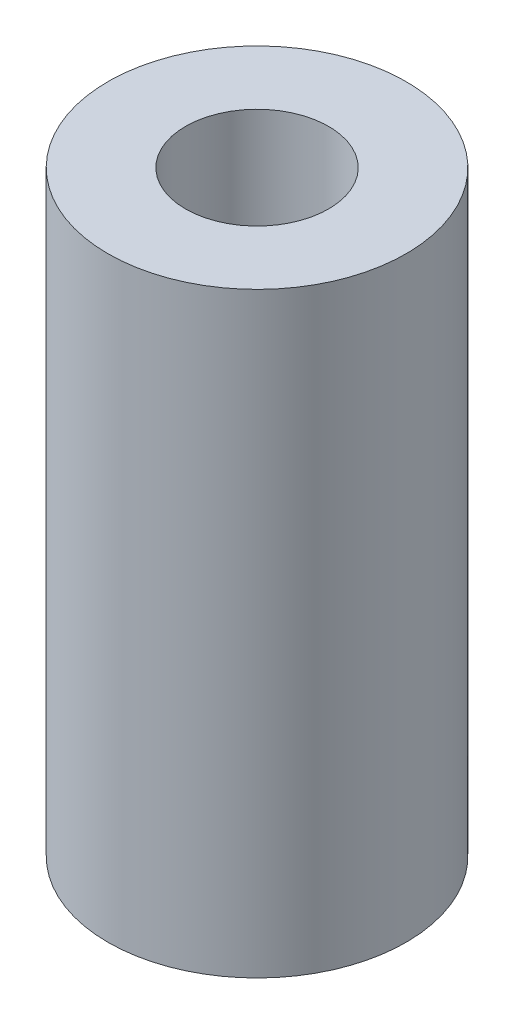
ISO-10303-21;
HEADER;
FILE_DESCRIPTION(('STEP AP214'),'2;1');
FILE_NAME('part.step','',(''),(''),'','','');
FILE_SCHEMA(('AUTOMOTIVE_DESIGN { 1 0 10303 214 1 1 1 1 }'));
ENDSEC;
DATA;
#1=APPLICATION_CONTEXT('core data for automotive mechanical design processes');
#2=APPLICATION_PROTOCOL_DEFINITION('international standard','automotive_design',2000,#1);
#3=PRODUCT_CONTEXT('',#1,'mechanical');
#4=PRODUCT('Part','Part','',(#3));
#5=PRODUCT_RELATED_PRODUCT_CATEGORY('part','',(#4));
#6=PRODUCT_DEFINITION_FORMATION('','',#4);
#7=PRODUCT_DEFINITION_CONTEXT('part definition',#1,'design');
#8=PRODUCT_DEFINITION('design','',#6,#7);
#9=PRODUCT_DEFINITION_SHAPE('','',#8);
#10=(LENGTH_UNIT() NAMED_UNIT(*) SI_UNIT(.MILLI.,.METRE.));
#11=(NAMED_UNIT(*) PLANE_ANGLE_UNIT() SI_UNIT($,.RADIAN.));
#12=(NAMED_UNIT(*) SI_UNIT($,.STERADIAN.) SOLID_ANGLE_UNIT());
#13=UNCERTAINTY_MEASURE_WITH_UNIT(LENGTH_MEASURE(1.E-05),#10,'distance_accuracy_value','');
#14=(GEOMETRIC_REPRESENTATION_CONTEXT(3) GLOBAL_UNCERTAINTY_ASSIGNED_CONTEXT((#13)) GLOBAL_UNIT_ASSIGNED_CONTEXT((#10,
#11,#12)) REPRESENTATION_CONTEXT('',''));
#15=CARTESIAN_POINT('',(0.,0.,0.));
#16=DIRECTION('',(0.,0.,1.));
#17=DIRECTION('',(1.,0.,0.));
#18=AXIS2_PLACEMENT_3D('',#15,#16,#17);
#19=CARTESIAN_POINT('',(0.,10.,0.));
#20=DIRECTION('',(0.,-1.,0.));
#21=DIRECTION('',(0.,0.,-1.));
#22=AXIS2_PLACEMENT_3D('',#19,#20,#21);
#23=CYLINDRICAL_SURFACE('',#22,2.5);
#24=CARTESIAN_POINT('',(0.,10.,0.));
#25=DIRECTION('',(0.,1.,0.));
#26=DIRECTION('',(0.,0.,1.));
#27=AXIS2_PLACEMENT_3D('',#24,#25,#26);
#28=CIRCLE('',#27,2.5);
#29=CARTESIAN_POINT('',(0.,10.,2.5));
#30=VERTEX_POINT('',#29);
#31=EDGE_CURVE('E10',#30,#30,#28,.T.);
#32=ORIENTED_EDGE('',*,*,#31,.F.);
#33=EDGE_LOOP('',(#32));
#34=FACE_BOUND('',#33,.T.);
#35=CARTESIAN_POINT('',(0.,0.,0.));
#36=DIRECTION('',(0.,1.,0.));
#37=DIRECTION('',(0.,0.,1.));
#38=AXIS2_PLACEMENT_3D('',#35,#36,#37);
#39=CIRCLE('',#38,2.5);
#40=CARTESIAN_POINT('',(0.,0.,2.5));
#41=VERTEX_POINT('',#40);
#42=EDGE_CURVE('E35',#41,#41,#39,.T.);
#43=ORIENTED_EDGE('',*,*,#42,.T.);
#44=EDGE_LOOP('',(#43));
#45=FACE_BOUND('',#44,.T.);
#46=ADVANCED_FACE('F32',(#34,#45),#23,.T.);
#47=CARTESIAN_POINT('',(0.,10.,0.));
#48=DIRECTION('',(0.,1.,0.));
#49=DIRECTION('',(0.,0.,1.));
#50=AXIS2_PLACEMENT_3D('',#47,#48,#49);
#51=PLANE('',#50);
#52=CARTESIAN_POINT('',(0.,10.,0.));
#53=DIRECTION('',(0.,1.,0.));
#54=DIRECTION('',(0.,0.,1.));
#55=AXIS2_PLACEMENT_3D('',#52,#53,#54);
#56=CIRCLE('',#55,1.2);
#57=CARTESIAN_POINT('',(0.,10.,1.2));
#58=VERTEX_POINT('',#57);
#59=EDGE_CURVE('E44',#58,#58,#56,.T.);
#60=ORIENTED_EDGE('',*,*,#59,.F.);
#61=EDGE_LOOP('',(#60));
#62=FACE_BOUND('',#61,.T.);
#63=ORIENTED_EDGE('',*,*,#31,.T.);
#64=EDGE_LOOP('',(#63));
#65=FACE_BOUND('',#64,.T.);
#66=ADVANCED_FACE('F69',(#62,#65),#51,.T.);
#67=CARTESIAN_POINT('',(0.,0.,0.));
#68=DIRECTION('',(0.,1.,0.));
#69=DIRECTION('',(0.,0.,1.));
#70=AXIS2_PLACEMENT_3D('',#67,#68,#69);
#71=PLANE('',#70);
#72=CARTESIAN_POINT('',(0.,0.,0.));
#73=DIRECTION('',(0.,-1.,0.));
#74=DIRECTION('',(0.,0.,-1.));
#75=AXIS2_PLACEMENT_3D('',#72,#73,#74);
#76=CIRCLE('',#75,1.2);
#77=CARTESIAN_POINT('',(0.,0.,-1.2));
#78=VERTEX_POINT('',#77);
#79=EDGE_CURVE('E50',#78,#78,#76,.T.);
#80=ORIENTED_EDGE('',*,*,#79,.F.);
#81=EDGE_LOOP('',(#80));
#82=FACE_BOUND('',#81,.T.);
#83=ORIENTED_EDGE('',*,*,#42,.F.);
#84=EDGE_LOOP('',(#83));
#85=FACE_BOUND('',#84,.T.);
#86=ADVANCED_FACE('F65',(#82,#85),#71,.F.);
#87=CARTESIAN_POINT('',(0.,7.,0.));
#88=DIRECTION('',(0.,1.,0.));
#89=DIRECTION('',(0.,0.,1.));
#90=AXIS2_PLACEMENT_3D('',#87,#88,#89);
#91=CYLINDRICAL_SURFACE('',#90,1.2);
#92=CARTESIAN_POINT('',(0.,7.,0.));
#93=DIRECTION('',(0.,1.,0.));
#94=DIRECTION('',(0.,0.,1.));
#95=AXIS2_PLACEMENT_3D('',#92,#93,#94);
#96=CIRCLE('',#95,1.2);
#97=CARTESIAN_POINT('',(0.,7.,1.2));
#98=VERTEX_POINT('',#97);
#99=EDGE_CURVE('E42',#98,#98,#96,.T.);
#100=ORIENTED_EDGE('',*,*,#99,.F.);
#101=EDGE_LOOP('',(#100));
#102=FACE_BOUND('',#101,.T.);
#103=ORIENTED_EDGE('',*,*,#59,.T.);
#104=EDGE_LOOP('',(#103));
#105=FACE_BOUND('',#104,.T.);
#106=ADVANCED_FACE('F68',(#102,#105),#91,.F.);
#107=CARTESIAN_POINT('',(0.,7.,0.));
#108=DIRECTION('',(0.,1.,0.));
#109=DIRECTION('',(0.,0.,1.));
#110=AXIS2_PLACEMENT_3D('',#107,#108,#109);
#111=PLANE('',#110);
#112=ORIENTED_EDGE('',*,*,#99,.T.);
#113=EDGE_LOOP('',(#112));
#114=FACE_BOUND('',#113,.T.);
#115=ADVANCED_FACE('F61',(#114),#111,.T.);
#116=CARTESIAN_POINT('',(0.,3.,0.));
#117=DIRECTION('',(0.,-1.,0.));
#118=DIRECTION('',(0.,0.,-1.));
#119=AXIS2_PLACEMENT_3D('',#116,#117,#118);
#120=CYLINDRICAL_SURFACE('',#119,1.2);
#121=CARTESIAN_POINT('',(0.,3.,0.));
#122=DIRECTION('',(0.,-1.,0.));
#123=DIRECTION('',(0.,0.,-1.));
#124=AXIS2_PLACEMENT_3D('',#121,#122,#123);
#125=CIRCLE('',#124,1.2);
#126=CARTESIAN_POINT('',(0.,3.,-1.2));
#127=VERTEX_POINT('',#126);
#128=EDGE_CURVE('E47',#127,#127,#125,.T.);
#129=ORIENTED_EDGE('',*,*,#128,.F.);
#130=EDGE_LOOP('',(#129));
#131=FACE_BOUND('',#130,.T.);
#132=ORIENTED_EDGE('',*,*,#79,.T.);
#133=EDGE_LOOP('',(#132));
#134=FACE_BOUND('',#133,.T.);
#135=ADVANCED_FACE('F58',(#131,#134),#120,.F.);
#136=CARTESIAN_POINT('',(0.,3.,0.));
#137=DIRECTION('',(0.,-1.,0.));
#138=DIRECTION('',(0.,0.,-1.));
#139=AXIS2_PLACEMENT_3D('',#136,#137,#138);
#140=PLANE('',#139);
#141=ORIENTED_EDGE('',*,*,#128,.T.);
#142=EDGE_LOOP('',(#141));
#143=FACE_BOUND('',#142,.T.);
#144=ADVANCED_FACE('F56',(#143),#140,.T.);
#145=CLOSED_SHELL('',(#46,#66,#86,#106,#115,#135,#144));
#146=MANIFOLD_SOLID_BREP('B2',#145);
#147=ADVANCED_BREP_SHAPE_REPRESENTATION('',(#18,#146),#14);
#148=SHAPE_DEFINITION_REPRESENTATION(#9,#147);
ENDSEC;
END-ISO-10303-21;
